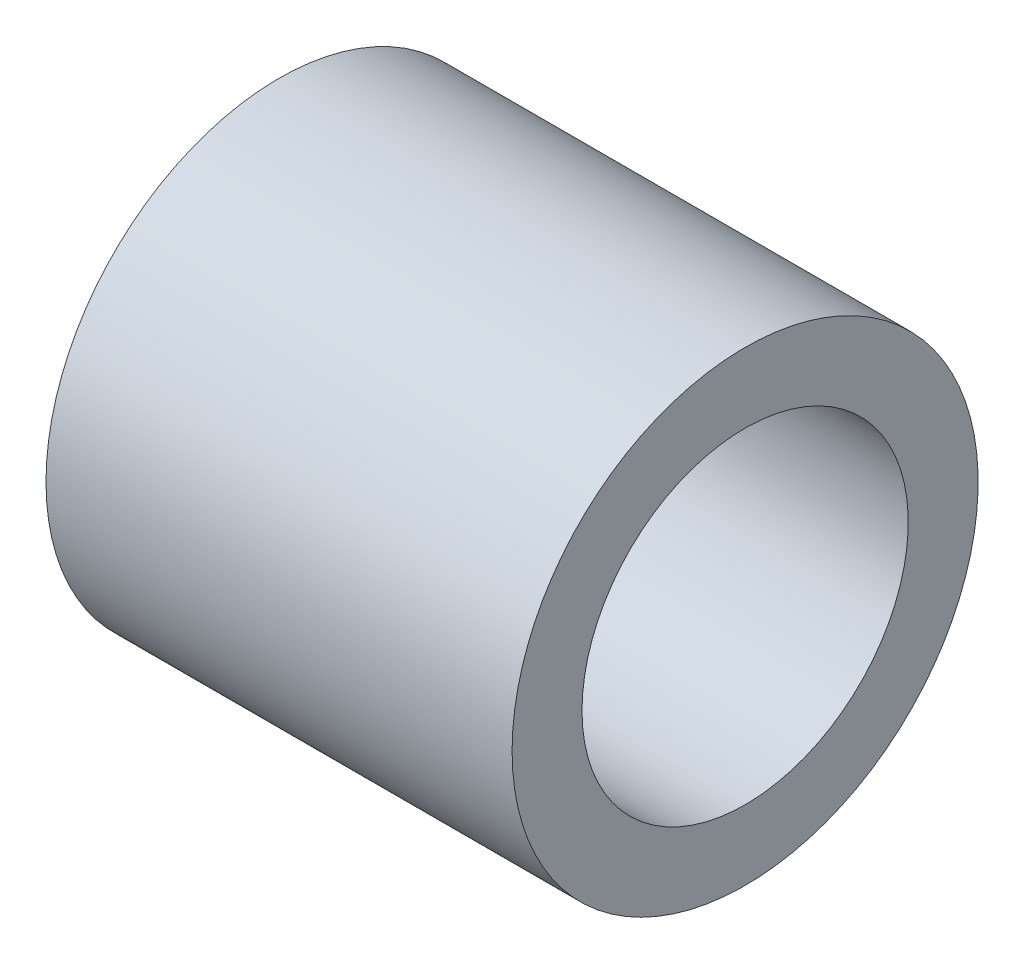
ISO-10303-21;
HEADER;
FILE_DESCRIPTION(('STEP AP214'),'2;1');
FILE_NAME('part.step','',(''),(''),'','','');
FILE_SCHEMA(('AUTOMOTIVE_DESIGN { 1 0 10303 214 1 1 1 1 }'));
ENDSEC;
DATA;
#1=APPLICATION_CONTEXT('core data for automotive mechanical design processes');
#2=APPLICATION_PROTOCOL_DEFINITION('international standard','automotive_design',2000,#1);
#3=PRODUCT_CONTEXT('',#1,'mechanical');
#4=PRODUCT('Part','Part','',(#3));
#5=PRODUCT_RELATED_PRODUCT_CATEGORY('part','',(#4));
#6=PRODUCT_DEFINITION_FORMATION('','',#4);
#7=PRODUCT_DEFINITION_CONTEXT('part definition',#1,'design');
#8=PRODUCT_DEFINITION('design','',#6,#7);
#9=PRODUCT_DEFINITION_SHAPE('','',#8);
#10=(LENGTH_UNIT() NAMED_UNIT(*) SI_UNIT(.MILLI.,.METRE.));
#11=(NAMED_UNIT(*) PLANE_ANGLE_UNIT() SI_UNIT($,.RADIAN.));
#12=(NAMED_UNIT(*) SI_UNIT($,.STERADIAN.) SOLID_ANGLE_UNIT());
#13=UNCERTAINTY_MEASURE_WITH_UNIT(LENGTH_MEASURE(1.E-05),#10,'distance_accuracy_value','');
#14=(GEOMETRIC_REPRESENTATION_CONTEXT(3) GLOBAL_UNCERTAINTY_ASSIGNED_CONTEXT((#13)) GLOBAL_UNIT_ASSIGNED_CONTEXT((#10,
#11,#12)) REPRESENTATION_CONTEXT('',''));
#15=CARTESIAN_POINT('',(0.,0.,0.));
#16=DIRECTION('',(0.,0.,1.));
#17=DIRECTION('',(1.,0.,0.));
#18=AXIS2_PLACEMENT_3D('',#15,#16,#17);
#19=CARTESIAN_POINT('',(0.,7.,0.));
#20=DIRECTION('',(1.,0.,0.));
#21=DIRECTION('',(0.,0.,-1.));
#22=AXIS2_PLACEMENT_3D('',#19,#20,#21);
#23=PLANE('',#22);
#24=CARTESIAN_POINT('',(0.,0.,0.));
#25=DIRECTION('',(-1.,0.,0.));
#26=DIRECTION('',(0.,0.,1.));
#27=AXIS2_PLACEMENT_3D('',#24,#25,#26);
#28=CIRCLE('',#27,7.);
#29=CARTESIAN_POINT('',(0.,0.,7.));
#30=VERTEX_POINT('',#29);
#31=EDGE_CURVE('E46',#30,#30,#28,.T.);
#32=ORIENTED_EDGE('',*,*,#31,.F.);
#33=EDGE_LOOP('',(#32));
#34=FACE_BOUND('',#33,.T.);
#35=CARTESIAN_POINT('',(0.,0.,0.));
#36=DIRECTION('',(-1.,0.,0.));
#37=DIRECTION('',(0.,0.,1.));
#38=AXIS2_PLACEMENT_3D('',#35,#36,#37);
#39=CIRCLE('',#38,10.);
#40=CARTESIAN_POINT('',(0.,0.,10.));
#41=VERTEX_POINT('',#40);
#42=EDGE_CURVE('E10',#41,#41,#39,.T.);
#43=ORIENTED_EDGE('',*,*,#42,.T.);
#44=EDGE_LOOP('',(#43));
#45=FACE_BOUND('',#44,.T.);
#46=ADVANCED_FACE('F32',(#34,#45),#23,.F.);
#47=CARTESIAN_POINT('',(0.,0.,0.));
#48=DIRECTION('',(-1.,0.,0.));
#49=DIRECTION('',(0.,0.,1.));
#50=AXIS2_PLACEMENT_3D('',#47,#48,#49);
#51=CYLINDRICAL_SURFACE('',#50,10.);
#52=ORIENTED_EDGE('',*,*,#42,.F.);
#53=EDGE_LOOP('',(#52));
#54=FACE_BOUND('',#53,.T.);
#55=CARTESIAN_POINT('',(20.,0.,0.));
#56=DIRECTION('',(-1.,0.,0.));
#57=DIRECTION('',(0.,0.,1.));
#58=AXIS2_PLACEMENT_3D('',#55,#56,#57);
#59=CIRCLE('',#58,10.);
#60=CARTESIAN_POINT('',(20.,0.,10.));
#61=VERTEX_POINT('',#60);
#62=EDGE_CURVE('E38',#61,#61,#59,.T.);
#63=ORIENTED_EDGE('',*,*,#62,.T.);
#64=EDGE_LOOP('',(#63));
#65=FACE_BOUND('',#64,.T.);
#66=ADVANCED_FACE('F55',(#54,#65),#51,.T.);
#67=CARTESIAN_POINT('',(20.,7.,0.));
#68=DIRECTION('',(-1.,0.,0.));
#69=DIRECTION('',(0.,0.,1.));
#70=AXIS2_PLACEMENT_3D('',#67,#68,#69);
#71=PLANE('',#70);
#72=ORIENTED_EDGE('',*,*,#62,.F.);
#73=EDGE_LOOP('',(#72));
#74=FACE_BOUND('',#73,.T.);
#75=CARTESIAN_POINT('',(20.,0.,0.));
#76=DIRECTION('',(-1.,0.,0.));
#77=DIRECTION('',(0.,0.,1.));
#78=AXIS2_PLACEMENT_3D('',#75,#76,#77);
#79=CIRCLE('',#78,7.);
#80=CARTESIAN_POINT('',(20.,0.,7.));
#81=VERTEX_POINT('',#80);
#82=EDGE_CURVE('E42',#81,#81,#79,.T.);
#83=ORIENTED_EDGE('',*,*,#82,.T.);
#84=EDGE_LOOP('',(#83));
#85=FACE_BOUND('',#84,.T.);
#86=ADVANCED_FACE('F59',(#74,#85),#71,.F.);
#87=CARTESIAN_POINT('',(0.,0.,0.));
#88=DIRECTION('',(-1.,0.,0.));
#89=DIRECTION('',(0.,0.,1.));
#90=AXIS2_PLACEMENT_3D('',#87,#88,#89);
#91=CYLINDRICAL_SURFACE('',#90,7.);
#92=ORIENTED_EDGE('',*,*,#82,.F.);
#93=EDGE_LOOP('',(#92));
#94=FACE_BOUND('',#93,.T.);
#95=ORIENTED_EDGE('',*,*,#31,.T.);
#96=EDGE_LOOP('',(#95));
#97=FACE_BOUND('',#96,.T.);
#98=ADVANCED_FACE('F52',(#94,#97),#91,.F.);
#99=CLOSED_SHELL('',(#46,#66,#86,#98));
#100=MANIFOLD_SOLID_BREP('B2',#99);
#101=ADVANCED_BREP_SHAPE_REPRESENTATION('',(#18,#100),#14);
#102=SHAPE_DEFINITION_REPRESENTATION(#9,#101);
ENDSEC;
END-ISO-10303-21;
